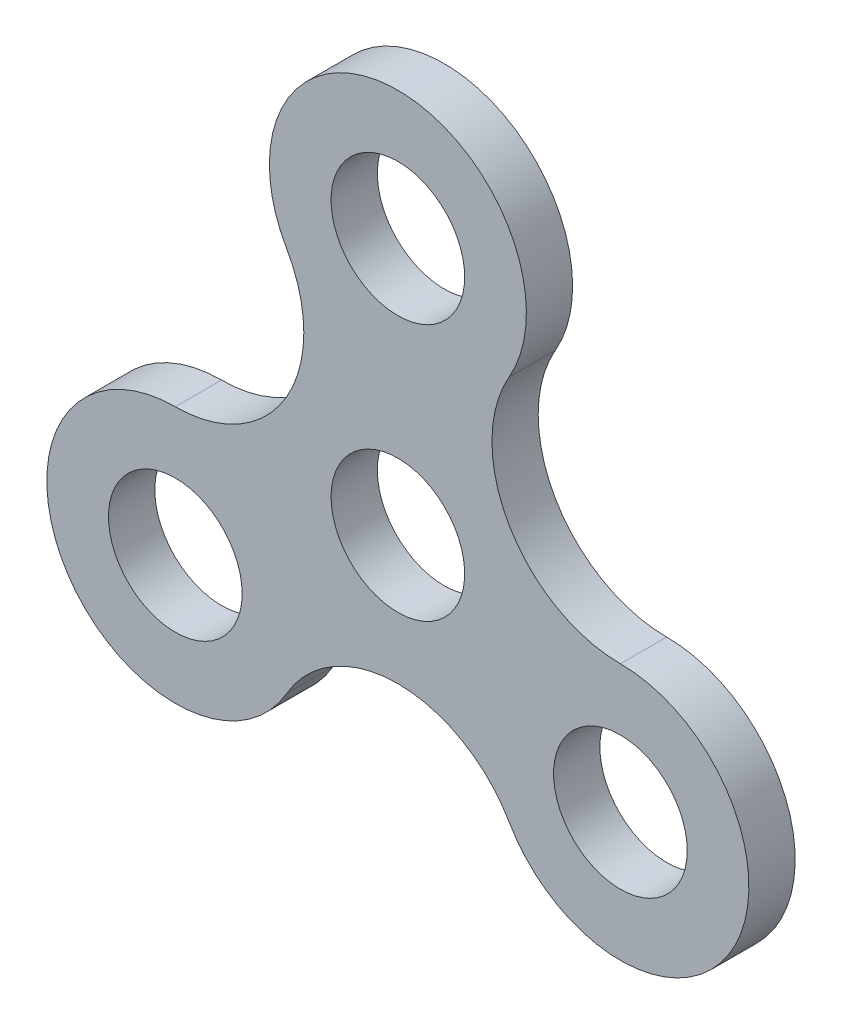
ISO-10303-21;
HEADER;
FILE_DESCRIPTION(('STEP AP214'),'2;1');
FILE_NAME('part.step','',(''),(''),'','','');
FILE_SCHEMA(('AUTOMOTIVE_DESIGN { 1 0 10303 214 1 1 1 1 }'));
ENDSEC;
DATA;
#1=APPLICATION_CONTEXT('core data for automotive mechanical design processes');
#2=APPLICATION_PROTOCOL_DEFINITION('international standard','automotive_design',2000,#1);
#3=PRODUCT_CONTEXT('',#1,'mechanical');
#4=PRODUCT('Part','Part','',(#3));
#5=PRODUCT_RELATED_PRODUCT_CATEGORY('part','',(#4));
#6=PRODUCT_DEFINITION_FORMATION('','',#4);
#7=PRODUCT_DEFINITION_CONTEXT('part definition',#1,'design');
#8=PRODUCT_DEFINITION('design','',#6,#7);
#9=PRODUCT_DEFINITION_SHAPE('','',#8);
#10=(LENGTH_UNIT() NAMED_UNIT(*) SI_UNIT(.MILLI.,.METRE.));
#11=(NAMED_UNIT(*) PLANE_ANGLE_UNIT() SI_UNIT($,.RADIAN.));
#12=(NAMED_UNIT(*) SI_UNIT($,.STERADIAN.) SOLID_ANGLE_UNIT());
#13=UNCERTAINTY_MEASURE_WITH_UNIT(LENGTH_MEASURE(1.E-05),#10,'distance_accuracy_value','');
#14=(GEOMETRIC_REPRESENTATION_CONTEXT(3) GLOBAL_UNCERTAINTY_ASSIGNED_CONTEXT((#13)) GLOBAL_UNIT_ASSIGNED_CONTEXT((#10,
#11,#12)) REPRESENTATION_CONTEXT('',''));
#15=CARTESIAN_POINT('',(0.,0.,0.));
#16=DIRECTION('',(0.,0.,1.));
#17=DIRECTION('',(1.,0.,0.));
#18=AXIS2_PLACEMENT_3D('',#15,#16,#17);
#19=CARTESIAN_POINT('',(433.012701892219,249.999999999998,45.));
#20=DIRECTION('',(0.,0.,-1.));
#21=DIRECTION('',(-1.,0.,0.));
#22=AXIS2_PLACEMENT_3D('',#19,#20,#21);
#23=CYLINDRICAL_SURFACE('',#22,250.);
#24=CARTESIAN_POINT('',(433.012701892219,249.999999999998,-45.));
#25=DIRECTION('',(0.,0.,-1.));
#26=DIRECTION('',(1.,0.,0.));
#27=AXIS2_PLACEMENT_3D('',#24,#25,#26);
#28=CIRCLE('',#27,250.);
#29=CARTESIAN_POINT('',(433.012701892219,-1.88737914186277E-12,-45.));
#30=VERTEX_POINT('',#29);
#31=CARTESIAN_POINT('',(216.506350946109,374.999999999999,-45.));
#32=VERTEX_POINT('',#31);
#33=EDGE_CURVE('E118',#30,#32,#28,.T.);
#34=ORIENTED_EDGE('',*,*,#33,.T.);
#35=DIRECTION('',(0.,0.,-1.));
#36=VECTOR('',#35,1.);
#37=CARTESIAN_POINT('',(216.506350946109,374.999999999999,45.));
#38=LINE('',#37,#36);
#39=CARTESIAN_POINT('',(216.506350946109,374.999999999999,45.));
#40=VERTEX_POINT('',#39);
#41=EDGE_CURVE('E11',#40,#32,#38,.T.);
#42=ORIENTED_EDGE('',*,*,#41,.F.);
#43=CARTESIAN_POINT('',(433.012701892219,249.999999999998,45.));
#44=DIRECTION('',(0.,0.,-1.));
#45=DIRECTION('',(1.,0.,0.));
#46=AXIS2_PLACEMENT_3D('',#43,#44,#45);
#47=CIRCLE('',#46,250.);
#48=CARTESIAN_POINT('',(433.012701892219,-1.88737914186277E-12,45.));
#49=VERTEX_POINT('',#48);
#50=EDGE_CURVE('E129',#49,#40,#47,.T.);
#51=ORIENTED_EDGE('',*,*,#50,.F.);
#52=DIRECTION('',(0.,0.,-1.));
#53=VECTOR('',#52,1.);
#54=CARTESIAN_POINT('',(433.012701892219,-1.88737914186277E-12,45.));
#55=LINE('',#54,#53);
#56=EDGE_CURVE('E114',#49,#30,#55,.T.);
#57=ORIENTED_EDGE('',*,*,#56,.T.);
#58=EDGE_LOOP('',(#34,#42,#51,#57));
#59=FACE_BOUND('',#58,.T.);
#60=ADVANCED_FACE('F34',(#59),#23,.F.);
#61=CARTESIAN_POINT('',(0.,500.,45.));
#62=DIRECTION('',(0.,0.,-1.));
#63=DIRECTION('',(-1.,0.,0.));
#64=AXIS2_PLACEMENT_3D('',#61,#62,#63);
#65=CYLINDRICAL_SURFACE('',#64,250.);
#66=CARTESIAN_POINT('',(0.,500.,-45.));
#67=DIRECTION('',(0.,0.,1.));
#68=DIRECTION('',(1.,0.,0.));
#69=AXIS2_PLACEMENT_3D('',#66,#67,#68);
#70=CIRCLE('',#69,250.);
#71=CARTESIAN_POINT('',(-216.50635094611,374.999999999999,-45.));
#72=VERTEX_POINT('',#71);
#73=EDGE_CURVE('E121',#32,#72,#70,.T.);
#74=ORIENTED_EDGE('',*,*,#73,.T.);
#75=DIRECTION('',(0.,0.,-1.));
#76=VECTOR('',#75,1.);
#77=CARTESIAN_POINT('',(-216.50635094611,374.999999999999,45.));
#78=LINE('',#77,#76);
#79=CARTESIAN_POINT('',(-216.50635094611,374.999999999999,45.));
#80=VERTEX_POINT('',#79);
#81=EDGE_CURVE('E42',#80,#72,#78,.T.);
#82=ORIENTED_EDGE('',*,*,#81,.F.);
#83=CARTESIAN_POINT('',(0.,500.,45.));
#84=DIRECTION('',(0.,0.,1.));
#85=DIRECTION('',(1.,0.,0.));
#86=AXIS2_PLACEMENT_3D('',#83,#84,#85);
#87=CIRCLE('',#86,250.);
#88=EDGE_CURVE('E87',#40,#80,#87,.T.);
#89=ORIENTED_EDGE('',*,*,#88,.F.);
#90=ORIENTED_EDGE('',*,*,#41,.T.);
#91=EDGE_LOOP('',(#74,#82,#89,#90));
#92=FACE_BOUND('',#91,.T.);
#93=ADVANCED_FACE('F154',(#92),#65,.T.);
#94=CARTESIAN_POINT('',(-433.01270189222,249.999999999999,45.));
#95=DIRECTION('',(0.,0.,-1.));
#96=DIRECTION('',(-1.,0.,0.));
#97=AXIS2_PLACEMENT_3D('',#94,#95,#96);
#98=CYLINDRICAL_SURFACE('',#97,250.000000000001);
#99=CARTESIAN_POINT('',(-433.01270189222,249.999999999999,-45.));
#100=DIRECTION('',(0.,0.,-1.));
#101=DIRECTION('',(1.,0.,0.));
#102=AXIS2_PLACEMENT_3D('',#99,#100,#101);
#103=CIRCLE('',#102,250.000000000001);
#104=CARTESIAN_POINT('',(-433.012701892219,-1.88737914186277E-12,-45.));
#105=VERTEX_POINT('',#104);
#106=EDGE_CURVE('E124',#72,#105,#103,.T.);
#107=ORIENTED_EDGE('',*,*,#106,.T.);
#108=DIRECTION('',(0.,0.,-1.));
#109=VECTOR('',#108,1.);
#110=CARTESIAN_POINT('',(-433.012701892219,-1.88737914186277E-12,45.));
#111=LINE('',#110,#109);
#112=CARTESIAN_POINT('',(-433.012701892219,-1.88737914186277E-12,45.));
#113=VERTEX_POINT('',#112);
#114=EDGE_CURVE('E109',#113,#105,#111,.T.);
#115=ORIENTED_EDGE('',*,*,#114,.F.);
#116=CARTESIAN_POINT('',(-433.01270189222,249.999999999999,45.));
#117=DIRECTION('',(0.,0.,-1.));
#118=DIRECTION('',(1.,0.,0.));
#119=AXIS2_PLACEMENT_3D('',#116,#117,#118);
#120=CIRCLE('',#119,250.000000000001);
#121=EDGE_CURVE('E100',#80,#113,#120,.T.);
#122=ORIENTED_EDGE('',*,*,#121,.F.);
#123=ORIENTED_EDGE('',*,*,#81,.T.);
#124=EDGE_LOOP('',(#107,#115,#122,#123));
#125=FACE_BOUND('',#124,.T.);
#126=ADVANCED_FACE('F135',(#125),#98,.F.);
#127=CARTESIAN_POINT('',(-433.012701892218,-250.000000000002,45.));
#128=DIRECTION('',(0.,0.,-1.));
#129=DIRECTION('',(-1.,0.,0.));
#130=AXIS2_PLACEMENT_3D('',#127,#128,#129);
#131=CYLINDRICAL_SURFACE('',#130,250.);
#132=CARTESIAN_POINT('',(-433.012701892218,-250.000000000002,-45.));
#133=DIRECTION('',(0.,0.,1.));
#134=DIRECTION('',(1.,0.,0.));
#135=AXIS2_PLACEMENT_3D('',#132,#133,#134);
#136=CIRCLE('',#135,250.);
#137=CARTESIAN_POINT('',(-216.506350946107,-375.,-45.));
#138=VERTEX_POINT('',#137);
#139=EDGE_CURVE('E108',#105,#138,#136,.T.);
#140=ORIENTED_EDGE('',*,*,#139,.T.);
#141=DIRECTION('',(0.,0.,-1.));
#142=VECTOR('',#141,1.);
#143=CARTESIAN_POINT('',(-216.506350946107,-375.,45.));
#144=LINE('',#143,#142);
#145=CARTESIAN_POINT('',(-216.506350946107,-375.,45.));
#146=VERTEX_POINT('',#145);
#147=EDGE_CURVE('E105',#146,#138,#144,.T.);
#148=ORIENTED_EDGE('',*,*,#147,.F.);
#149=CARTESIAN_POINT('',(-433.012701892218,-250.000000000002,45.));
#150=DIRECTION('',(0.,0.,1.));
#151=DIRECTION('',(1.,0.,0.));
#152=AXIS2_PLACEMENT_3D('',#149,#150,#151);
#153=CIRCLE('',#152,250.);
#154=EDGE_CURVE('E94',#113,#146,#153,.T.);
#155=ORIENTED_EDGE('',*,*,#154,.F.);
#156=ORIENTED_EDGE('',*,*,#114,.T.);
#157=EDGE_LOOP('',(#140,#148,#155,#156));
#158=FACE_BOUND('',#157,.T.);
#159=ADVANCED_FACE('F106',(#158),#131,.T.);
#160=CARTESIAN_POINT('',(1.67617655866259E-13,-499.999999999996,45.));
#161=DIRECTION('',(0.,0.,-1.));
#162=DIRECTION('',(-1.,0.,0.));
#163=AXIS2_PLACEMENT_3D('',#160,#161,#162);
#164=CYLINDRICAL_SURFACE('',#163,249.999999999996);
#165=CARTESIAN_POINT('',(1.67617655866259E-13,-499.999999999996,-45.));
#166=DIRECTION('',(0.,0.,-1.));
#167=DIRECTION('',(1.,0.,0.));
#168=AXIS2_PLACEMENT_3D('',#165,#166,#167);
#169=CIRCLE('',#168,249.999999999996);
#170=CARTESIAN_POINT('',(216.506350946107,-375.,-45.));
#171=VERTEX_POINT('',#170);
#172=EDGE_CURVE('E73',#138,#171,#169,.T.);
#173=ORIENTED_EDGE('',*,*,#172,.T.);
#174=DIRECTION('',(0.,0.,-1.));
#175=VECTOR('',#174,1.);
#176=CARTESIAN_POINT('',(216.506350946107,-375.,45.));
#177=LINE('',#176,#175);
#178=CARTESIAN_POINT('',(216.506350946107,-375.,45.));
#179=VERTEX_POINT('',#178);
#180=EDGE_CURVE('E110',#179,#171,#177,.T.);
#181=ORIENTED_EDGE('',*,*,#180,.F.);
#182=CARTESIAN_POINT('',(1.67617655866259E-13,-499.999999999996,45.));
#183=DIRECTION('',(0.,0.,-1.));
#184=DIRECTION('',(1.,0.,0.));
#185=AXIS2_PLACEMENT_3D('',#182,#183,#184);
#186=CIRCLE('',#185,249.999999999996);
#187=EDGE_CURVE('E98',#146,#179,#186,.T.);
#188=ORIENTED_EDGE('',*,*,#187,.F.);
#189=ORIENTED_EDGE('',*,*,#147,.T.);
#190=EDGE_LOOP('',(#173,#181,#188,#189));
#191=FACE_BOUND('',#190,.T.);
#192=ADVANCED_FACE('F112',(#191),#164,.F.);
#193=CARTESIAN_POINT('',(433.012701892218,-250.000000000002,45.));
#194=DIRECTION('',(0.,0.,-1.));
#195=DIRECTION('',(-1.,0.,0.));
#196=AXIS2_PLACEMENT_3D('',#193,#194,#195);
#197=CYLINDRICAL_SURFACE('',#196,250.);
#198=CARTESIAN_POINT('',(433.012701892218,-250.000000000002,-45.));
#199=DIRECTION('',(0.,0.,1.));
#200=DIRECTION('',(1.,0.,0.));
#201=AXIS2_PLACEMENT_3D('',#198,#199,#200);
#202=CIRCLE('',#201,250.);
#203=EDGE_CURVE('E79',#171,#30,#202,.T.);
#204=ORIENTED_EDGE('',*,*,#203,.T.);
#205=ORIENTED_EDGE('',*,*,#56,.F.);
#206=CARTESIAN_POINT('',(433.012701892218,-250.000000000002,45.));
#207=DIRECTION('',(0.,0.,1.));
#208=DIRECTION('',(1.,0.,0.));
#209=AXIS2_PLACEMENT_3D('',#206,#207,#208);
#210=CIRCLE('',#209,250.);
#211=EDGE_CURVE('E50',#179,#49,#210,.T.);
#212=ORIENTED_EDGE('',*,*,#211,.F.);
#213=ORIENTED_EDGE('',*,*,#180,.T.);
#214=EDGE_LOOP('',(#204,#205,#212,#213));
#215=FACE_BOUND('',#214,.T.);
#216=ADVANCED_FACE('F142',(#215),#197,.T.);
#217=CARTESIAN_POINT('',(433.012701892219,-1.80411241501588E-12,45.));
#218=DIRECTION('',(0.,0.,1.));
#219=DIRECTION('',(1.,0.,0.));
#220=AXIS2_PLACEMENT_3D('',#217,#218,#219);
#221=PLANE('',#220);
#222=CARTESIAN_POINT('',(-433.012701892218,-250.000000000002,45.));
#223=DIRECTION('',(0.,0.,1.));
#224=DIRECTION('',(1.,0.,0.));
#225=AXIS2_PLACEMENT_3D('',#222,#223,#224);
#226=CIRCLE('',#225,130.);
#227=CARTESIAN_POINT('',(-303.012701892218,-250.000000000002,45.));
#228=VERTEX_POINT('',#227);
#229=EDGE_CURVE('E240',#228,#228,#226,.T.);
#230=ORIENTED_EDGE('',*,*,#229,.F.);
#231=EDGE_LOOP('',(#230));
#232=FACE_BOUND('',#231,.T.);
#233=CARTESIAN_POINT('',(433.012701892218,-250.000000000002,45.));
#234=DIRECTION('',(0.,0.,1.));
#235=DIRECTION('',(1.,0.,0.));
#236=AXIS2_PLACEMENT_3D('',#233,#234,#235);
#237=CIRCLE('',#236,130.);
#238=CARTESIAN_POINT('',(563.012701892218,-250.000000000002,45.));
#239=VERTEX_POINT('',#238);
#240=EDGE_CURVE('E246',#239,#239,#237,.T.);
#241=ORIENTED_EDGE('',*,*,#240,.F.);
#242=EDGE_LOOP('',(#241));
#243=FACE_BOUND('',#242,.T.);
#244=CARTESIAN_POINT('',(0.,500.,45.));
#245=DIRECTION('',(0.,0.,1.));
#246=DIRECTION('',(1.,0.,0.));
#247=AXIS2_PLACEMENT_3D('',#244,#245,#246);
#248=CIRCLE('',#247,130.);
#249=CARTESIAN_POINT('',(130.,500.,45.));
#250=VERTEX_POINT('',#249);
#251=EDGE_CURVE('E254',#250,#250,#248,.T.);
#252=ORIENTED_EDGE('',*,*,#251,.F.);
#253=EDGE_LOOP('',(#252));
#254=FACE_BOUND('',#253,.T.);
#255=CARTESIAN_POINT('',(0.,0.,45.));
#256=DIRECTION('',(0.,0.,-1.));
#257=DIRECTION('',(-1.,0.,0.));
#258=AXIS2_PLACEMENT_3D('',#255,#256,#257);
#259=CIRCLE('',#258,130.);
#260=CARTESIAN_POINT('',(-130.,0.,45.));
#261=VERTEX_POINT('',#260);
#262=EDGE_CURVE('E122',#261,#261,#259,.T.);
#263=ORIENTED_EDGE('',*,*,#262,.T.);
#264=EDGE_LOOP('',(#263));
#265=FACE_BOUND('',#264,.T.);
#266=ORIENTED_EDGE('',*,*,#50,.T.);
#267=ORIENTED_EDGE('',*,*,#88,.T.);
#268=ORIENTED_EDGE('',*,*,#121,.T.);
#269=ORIENTED_EDGE('',*,*,#154,.T.);
#270=ORIENTED_EDGE('',*,*,#187,.T.);
#271=ORIENTED_EDGE('',*,*,#211,.T.);
#272=EDGE_LOOP('',(#266,#267,#268,#269,#270,#271));
#273=FACE_BOUND('',#272,.T.);
#274=ADVANCED_FACE('F96',(#232,#243,#254,#265,#273),#221,.T.);
#275=CARTESIAN_POINT('',(433.012701892219,-1.80411241501588E-12,-45.));
#276=DIRECTION('',(0.,0.,1.));
#277=DIRECTION('',(1.,0.,0.));
#278=AXIS2_PLACEMENT_3D('',#275,#276,#277);
#279=PLANE('',#278);
#280=CARTESIAN_POINT('',(-433.012701892218,-250.000000000002,-45.));
#281=DIRECTION('',(0.,0.,1.));
#282=DIRECTION('',(1.,0.,0.));
#283=AXIS2_PLACEMENT_3D('',#280,#281,#282);
#284=CIRCLE('',#283,130.);
#285=CARTESIAN_POINT('',(-303.012701892218,-250.000000000002,-45.));
#286=VERTEX_POINT('',#285);
#287=EDGE_CURVE('E237',#286,#286,#284,.T.);
#288=ORIENTED_EDGE('',*,*,#287,.T.);
#289=EDGE_LOOP('',(#288));
#290=FACE_BOUND('',#289,.T.);
#291=CARTESIAN_POINT('',(433.012701892218,-250.000000000002,-45.));
#292=DIRECTION('',(0.,0.,1.));
#293=DIRECTION('',(1.,0.,0.));
#294=AXIS2_PLACEMENT_3D('',#291,#292,#293);
#295=CIRCLE('',#294,130.);
#296=CARTESIAN_POINT('',(563.012701892218,-250.000000000002,-45.));
#297=VERTEX_POINT('',#296);
#298=EDGE_CURVE('E241',#297,#297,#295,.T.);
#299=ORIENTED_EDGE('',*,*,#298,.T.);
#300=EDGE_LOOP('',(#299));
#301=FACE_BOUND('',#300,.T.);
#302=CARTESIAN_POINT('',(0.,500.,-45.));
#303=DIRECTION('',(0.,0.,1.));
#304=DIRECTION('',(1.,0.,0.));
#305=AXIS2_PLACEMENT_3D('',#302,#303,#304);
#306=CIRCLE('',#305,130.);
#307=CARTESIAN_POINT('',(130.,500.,-45.));
#308=VERTEX_POINT('',#307);
#309=EDGE_CURVE('E251',#308,#308,#306,.T.);
#310=ORIENTED_EDGE('',*,*,#309,.T.);
#311=EDGE_LOOP('',(#310));
#312=FACE_BOUND('',#311,.T.);
#313=CARTESIAN_POINT('',(0.,0.,-45.));
#314=DIRECTION('',(0.,0.,-1.));
#315=DIRECTION('',(-1.,0.,0.));
#316=AXIS2_PLACEMENT_3D('',#313,#314,#315);
#317=CIRCLE('',#316,130.);
#318=CARTESIAN_POINT('',(-130.,0.,-45.));
#319=VERTEX_POINT('',#318);
#320=EDGE_CURVE('E243',#319,#319,#317,.T.);
#321=ORIENTED_EDGE('',*,*,#320,.F.);
#322=EDGE_LOOP('',(#321));
#323=FACE_BOUND('',#322,.T.);
#324=ORIENTED_EDGE('',*,*,#33,.F.);
#325=ORIENTED_EDGE('',*,*,#203,.F.);
#326=ORIENTED_EDGE('',*,*,#172,.F.);
#327=ORIENTED_EDGE('',*,*,#139,.F.);
#328=ORIENTED_EDGE('',*,*,#106,.F.);
#329=ORIENTED_EDGE('',*,*,#73,.F.);
#330=EDGE_LOOP('',(#324,#325,#326,#327,#328,#329));
#331=FACE_BOUND('',#330,.T.);
#332=ADVANCED_FACE('F138',(#290,#301,#312,#323,#331),#279,.F.);
#333=CARTESIAN_POINT('',(0.,0.,45.));
#334=DIRECTION('',(0.,0.,-1.));
#335=DIRECTION('',(-1.,0.,0.));
#336=AXIS2_PLACEMENT_3D('',#333,#334,#335);
#337=CYLINDRICAL_SURFACE('',#336,130.);
#338=CARTESIAN_POINT('',(-130.,0.,45.));
#339=CARTESIAN_POINT('',(-130.,0.,44.0625));
#340=CARTESIAN_POINT('',(-130.,0.,43.125));
#341=CARTESIAN_POINT('',(-130.,0.,41.25));
#342=CARTESIAN_POINT('',(-130.,0.,40.3125));
#343=CARTESIAN_POINT('',(-130.,0.,38.4375));
#344=CARTESIAN_POINT('',(-130.,0.,37.5));
#345=CARTESIAN_POINT('',(-130.,0.,35.625));
#346=CARTESIAN_POINT('',(-130.,0.,34.6875));
#347=CARTESIAN_POINT('',(-130.,0.,32.8125));
#348=CARTESIAN_POINT('',(-130.,0.,31.875));
#349=CARTESIAN_POINT('',(-130.,0.,30.));
#350=CARTESIAN_POINT('',(-130.,0.,29.0625));
#351=CARTESIAN_POINT('',(-130.,0.,27.1875));
#352=CARTESIAN_POINT('',(-130.,0.,26.25));
#353=CARTESIAN_POINT('',(-130.,0.,24.375));
#354=CARTESIAN_POINT('',(-130.,0.,23.4375));
#355=CARTESIAN_POINT('',(-130.,0.,21.5625));
#356=CARTESIAN_POINT('',(-130.,0.,20.625));
#357=CARTESIAN_POINT('',(-130.,0.,18.75));
#358=CARTESIAN_POINT('',(-130.,0.,17.8125));
#359=CARTESIAN_POINT('',(-130.,0.,15.9375));
#360=CARTESIAN_POINT('',(-130.,0.,15.));
#361=CARTESIAN_POINT('',(-130.,0.,13.125));
#362=CARTESIAN_POINT('',(-130.,0.,12.1875));
#363=CARTESIAN_POINT('',(-130.,0.,10.3125));
#364=CARTESIAN_POINT('',(-130.,0.,9.37500000000001));
#365=CARTESIAN_POINT('',(-130.,0.,7.50000000000001));
#366=CARTESIAN_POINT('',(-130.,0.,6.56250000000001));
#367=CARTESIAN_POINT('',(-130.,0.,4.68750000000001));
#368=CARTESIAN_POINT('',(-130.,0.,3.75000000000002));
#369=CARTESIAN_POINT('',(-130.,0.,1.87500000000002));
#370=CARTESIAN_POINT('',(-130.,0.,0.937500000000015));
#371=CARTESIAN_POINT('',(-130.,0.,-0.937499999999987));
#372=CARTESIAN_POINT('',(-130.,0.,-1.87499999999999));
#373=CARTESIAN_POINT('',(-130.,0.,-3.74999999999999));
#374=CARTESIAN_POINT('',(-130.,0.,-4.68749999999999));
#375=CARTESIAN_POINT('',(-130.,0.,-6.56249999999998));
#376=CARTESIAN_POINT('',(-130.,0.,-7.49999999999999));
#377=CARTESIAN_POINT('',(-130.,0.,-9.37499999999999));
#378=CARTESIAN_POINT('',(-130.,0.,-10.3125));
#379=CARTESIAN_POINT('',(-130.,0.,-12.1875));
#380=CARTESIAN_POINT('',(-130.,0.,-13.125));
#381=CARTESIAN_POINT('',(-130.,0.,-15.));
#382=CARTESIAN_POINT('',(-130.,0.,-15.9375));
#383=CARTESIAN_POINT('',(-130.,0.,-17.8125));
#384=CARTESIAN_POINT('',(-130.,0.,-18.75));
#385=CARTESIAN_POINT('',(-130.,0.,-20.625));
#386=CARTESIAN_POINT('',(-130.,0.,-21.5625));
#387=CARTESIAN_POINT('',(-130.,0.,-23.4375));
#388=CARTESIAN_POINT('',(-130.,0.,-24.375));
#389=CARTESIAN_POINT('',(-130.,0.,-26.25));
#390=CARTESIAN_POINT('',(-130.,0.,-27.1875));
#391=CARTESIAN_POINT('',(-130.,0.,-29.0625));
#392=CARTESIAN_POINT('',(-130.,0.,-30.));
#393=CARTESIAN_POINT('',(-130.,0.,-31.875));
#394=CARTESIAN_POINT('',(-130.,0.,-32.8125));
#395=CARTESIAN_POINT('',(-130.,0.,-34.6875));
#396=CARTESIAN_POINT('',(-130.,0.,-35.625));
#397=CARTESIAN_POINT('',(-130.,0.,-37.5));
#398=CARTESIAN_POINT('',(-130.,0.,-38.4375));
#399=CARTESIAN_POINT('',(-130.,0.,-40.3125));
#400=CARTESIAN_POINT('',(-130.,0.,-41.25));
#401=CARTESIAN_POINT('',(-130.,0.,-43.125));
#402=CARTESIAN_POINT('',(-130.,0.,-44.0625));
#403=CARTESIAN_POINT('',(-130.,0.,-45.));
#404=B_SPLINE_CURVE_WITH_KNOTS('',3,(#338,#339,#340,#341,#342,#343,#344,#345,#346,#347,#348,
#349,#350,#351,#352,#353,#354,#355,#356,#357,#358,#359,#360,#361,#362,#363,#364,#365,#366,#367,
#368,#369,#370,#371,#372,#373,#374,#375,#376,#377,#378,#379,#380,#381,#382,#383,#384,#385,#386,
#387,#388,#389,#390,#391,#392,#393,#394,#395,#396,#397,#398,#399,#400,#401,#402,#403),
.UNSPECIFIED.,.F.,.F.,(4,2,2,2,2,2,2,2,2,2,2,2,2,2,2,2,2,2,2,2,2,2,2,2,2,2,2,2,2,2,2,2,4),(0.,
2.8125,5.62500000000001,8.4375,11.25,14.0625,16.875,19.6875,22.5,25.3125,28.125,30.9375,33.75,
36.5625,39.375,42.1875,45.,47.8125,50.625,53.4375,56.25,59.0625,61.875,64.6875,67.5,70.3125,
73.125,75.9375,78.75,81.5625,84.375,87.1875,90.),.UNSPECIFIED.);
#405=EDGE_CURVE('BSEAM182',#261,#319,#404,.T.);
#406=ORIENTED_EDGE('',*,*,#262,.F.);
#407=ORIENTED_EDGE('',*,*,#320,.T.);
#408=ORIENTED_EDGE('',*,*,#405,.T.);
#409=ORIENTED_EDGE('',*,*,#405,.F.);
#410=EDGE_LOOP('',(#406,#408,#407,#409));
#411=FACE_BOUND('',#410,.T.);
#412=ADVANCED_FACE('F182',(#411),#337,.F.);
#413=CARTESIAN_POINT('',(0.,500.,-45.));
#414=DIRECTION('',(0.,0.,1.));
#415=DIRECTION('',(1.,0.,0.));
#416=AXIS2_PLACEMENT_3D('',#413,#414,#415);
#417=CYLINDRICAL_SURFACE('',#416,130.);
#418=CARTESIAN_POINT('',(130.,500.,-45.));
#419=CARTESIAN_POINT('',(130.,500.,-44.0625));
#420=CARTESIAN_POINT('',(130.,500.,-43.125));
#421=CARTESIAN_POINT('',(130.,500.,-41.25));
#422=CARTESIAN_POINT('',(130.,500.,-40.3125));
#423=CARTESIAN_POINT('',(130.,500.,-38.4375));
#424=CARTESIAN_POINT('',(130.,500.,-37.5));
#425=CARTESIAN_POINT('',(130.,500.,-35.625));
#426=CARTESIAN_POINT('',(130.,500.,-34.6875));
#427=CARTESIAN_POINT('',(130.,500.,-32.8125));
#428=CARTESIAN_POINT('',(130.,500.,-31.875));
#429=CARTESIAN_POINT('',(130.,500.,-30.));
#430=CARTESIAN_POINT('',(130.,500.,-29.0625));
#431=CARTESIAN_POINT('',(130.,500.,-27.1875));
#432=CARTESIAN_POINT('',(130.,500.,-26.25));
#433=CARTESIAN_POINT('',(130.,500.,-24.375));
#434=CARTESIAN_POINT('',(130.,500.,-23.4375));
#435=CARTESIAN_POINT('',(130.,500.,-21.5625));
#436=CARTESIAN_POINT('',(130.,500.,-20.625));
#437=CARTESIAN_POINT('',(130.,500.,-18.75));
#438=CARTESIAN_POINT('',(130.,500.,-17.8125));
#439=CARTESIAN_POINT('',(130.,500.,-15.9375));
#440=CARTESIAN_POINT('',(130.,500.,-15.));
#441=CARTESIAN_POINT('',(130.,500.,-13.125));
#442=CARTESIAN_POINT('',(130.,500.,-12.1875));
#443=CARTESIAN_POINT('',(130.,500.,-10.3125));
#444=CARTESIAN_POINT('',(130.,500.,-9.37500000000001));
#445=CARTESIAN_POINT('',(130.,500.,-7.50000000000001));
#446=CARTESIAN_POINT('',(130.,500.,-6.56250000000001));
#447=CARTESIAN_POINT('',(130.,500.,-4.68750000000001));
#448=CARTESIAN_POINT('',(130.,500.,-3.75000000000002));
#449=CARTESIAN_POINT('',(130.,500.,-1.87500000000002));
#450=CARTESIAN_POINT('',(130.,500.,-0.937500000000015));
#451=CARTESIAN_POINT('',(130.,500.,0.937499999999987));
#452=CARTESIAN_POINT('',(130.,500.,1.87499999999999));
#453=CARTESIAN_POINT('',(130.,500.,3.74999999999999));
#454=CARTESIAN_POINT('',(130.,500.,4.68749999999999));
#455=CARTESIAN_POINT('',(130.,500.,6.56249999999998));
#456=CARTESIAN_POINT('',(130.,500.,7.49999999999999));
#457=CARTESIAN_POINT('',(130.,500.,9.37499999999999));
#458=CARTESIAN_POINT('',(130.,500.,10.3125));
#459=CARTESIAN_POINT('',(130.,500.,12.1875));
#460=CARTESIAN_POINT('',(130.,500.,13.125));
#461=CARTESIAN_POINT('',(130.,500.,15.));
#462=CARTESIAN_POINT('',(130.,500.,15.9375));
#463=CARTESIAN_POINT('',(130.,500.,17.8125));
#464=CARTESIAN_POINT('',(130.,500.,18.75));
#465=CARTESIAN_POINT('',(130.,500.,20.625));
#466=CARTESIAN_POINT('',(130.,500.,21.5625));
#467=CARTESIAN_POINT('',(130.,500.,23.4375));
#468=CARTESIAN_POINT('',(130.,500.,24.375));
#469=CARTESIAN_POINT('',(130.,500.,26.25));
#470=CARTESIAN_POINT('',(130.,500.,27.1875));
#471=CARTESIAN_POINT('',(130.,500.,29.0625));
#472=CARTESIAN_POINT('',(130.,500.,30.));
#473=CARTESIAN_POINT('',(130.,500.,31.875));
#474=CARTESIAN_POINT('',(130.,500.,32.8125));
#475=CARTESIAN_POINT('',(130.,500.,34.6875));
#476=CARTESIAN_POINT('',(130.,500.,35.625));
#477=CARTESIAN_POINT('',(130.,500.,37.5));
#478=CARTESIAN_POINT('',(130.,500.,38.4375));
#479=CARTESIAN_POINT('',(130.,500.,40.3125));
#480=CARTESIAN_POINT('',(130.,500.,41.25));
#481=CARTESIAN_POINT('',(130.,500.,43.125));
#482=CARTESIAN_POINT('',(130.,500.,44.0625));
#483=CARTESIAN_POINT('',(130.,500.,45.));
#484=B_SPLINE_CURVE_WITH_KNOTS('',3,(#418,#419,#420,#421,#422,#423,#424,#425,#426,#427,#428,
#429,#430,#431,#432,#433,#434,#435,#436,#437,#438,#439,#440,#441,#442,#443,#444,#445,#446,#447,
#448,#449,#450,#451,#452,#453,#454,#455,#456,#457,#458,#459,#460,#461,#462,#463,#464,#465,#466,
#467,#468,#469,#470,#471,#472,#473,#474,#475,#476,#477,#478,#479,#480,#481,#482,#483),
.UNSPECIFIED.,.F.,.F.,(4,2,2,2,2,2,2,2,2,2,2,2,2,2,2,2,2,2,2,2,2,2,2,2,2,2,2,2,2,2,2,2,4),(0.,
2.8125,5.62500000000001,8.4375,11.25,14.0625,16.875,19.6875,22.5,25.3125,28.125,30.9375,33.75,
36.5625,39.375,42.1875,45.,47.8125,50.625,53.4375,56.25,59.0625,61.875,64.6875,67.5,70.3125,
73.125,75.9375,78.75,81.5625,84.375,87.1875,90.),.UNSPECIFIED.);
#485=EDGE_CURVE('BSEAM187',#308,#250,#484,.T.);
#486=ORIENTED_EDGE('',*,*,#309,.F.);
#487=ORIENTED_EDGE('',*,*,#251,.T.);
#488=ORIENTED_EDGE('',*,*,#485,.T.);
#489=ORIENTED_EDGE('',*,*,#485,.F.);
#490=EDGE_LOOP('',(#486,#488,#487,#489));
#491=FACE_BOUND('',#490,.T.);
#492=ADVANCED_FACE('F187',(#491),#417,.F.);
#493=CARTESIAN_POINT('',(433.012701892218,-250.000000000002,-45.));
#494=DIRECTION('',(0.,0.,1.));
#495=DIRECTION('',(1.,0.,0.));
#496=AXIS2_PLACEMENT_3D('',#493,#494,#495);
#497=CYLINDRICAL_SURFACE('',#496,130.);
#498=CARTESIAN_POINT('',(563.012701892218,-250.000000000002,-45.));
#499=CARTESIAN_POINT('',(563.012701892218,-250.000000000002,-44.0625));
#500=CARTESIAN_POINT('',(563.012701892218,-250.000000000002,-43.125));
#501=CARTESIAN_POINT('',(563.012701892218,-250.000000000002,-41.25));
#502=CARTESIAN_POINT('',(563.012701892218,-250.000000000002,-40.3125));
#503=CARTESIAN_POINT('',(563.012701892218,-250.000000000002,-38.4375));
#504=CARTESIAN_POINT('',(563.012701892218,-250.000000000002,-37.5));
#505=CARTESIAN_POINT('',(563.012701892218,-250.000000000002,-35.625));
#506=CARTESIAN_POINT('',(563.012701892218,-250.000000000002,-34.6875));
#507=CARTESIAN_POINT('',(563.012701892218,-250.000000000002,-32.8125));
#508=CARTESIAN_POINT('',(563.012701892218,-250.000000000002,-31.875));
#509=CARTESIAN_POINT('',(563.012701892218,-250.000000000002,-30.));
#510=CARTESIAN_POINT('',(563.012701892218,-250.000000000002,-29.0625));
#511=CARTESIAN_POINT('',(563.012701892218,-250.000000000002,-27.1875));
#512=CARTESIAN_POINT('',(563.012701892218,-250.000000000002,-26.25));
#513=CARTESIAN_POINT('',(563.012701892218,-250.000000000002,-24.375));
#514=CARTESIAN_POINT('',(563.012701892218,-250.000000000002,-23.4375));
#515=CARTESIAN_POINT('',(563.012701892218,-250.000000000002,-21.5625));
#516=CARTESIAN_POINT('',(563.012701892218,-250.000000000002,-20.625));
#517=CARTESIAN_POINT('',(563.012701892218,-250.000000000002,-18.75));
#518=CARTESIAN_POINT('',(563.012701892218,-250.000000000002,-17.8125));
#519=CARTESIAN_POINT('',(563.012701892218,-250.000000000002,-15.9375));
#520=CARTESIAN_POINT('',(563.012701892218,-250.000000000002,-15.));
#521=CARTESIAN_POINT('',(563.012701892218,-250.000000000002,-13.125));
#522=CARTESIAN_POINT('',(563.012701892218,-250.000000000002,-12.1875));
#523=CARTESIAN_POINT('',(563.012701892218,-250.000000000002,-10.3125));
#524=CARTESIAN_POINT('',(563.012701892218,-250.000000000002,-9.37500000000001));
#525=CARTESIAN_POINT('',(563.012701892218,-250.000000000002,-7.50000000000001));
#526=CARTESIAN_POINT('',(563.012701892218,-250.000000000002,-6.56250000000001));
#527=CARTESIAN_POINT('',(563.012701892218,-250.000000000002,-4.68750000000001));
#528=CARTESIAN_POINT('',(563.012701892218,-250.000000000002,-3.75000000000002));
#529=CARTESIAN_POINT('',(563.012701892218,-250.000000000002,-1.87500000000002));
#530=CARTESIAN_POINT('',(563.012701892218,-250.000000000002,-0.937500000000015));
#531=CARTESIAN_POINT('',(563.012701892218,-250.000000000002,0.937499999999987));
#532=CARTESIAN_POINT('',(563.012701892218,-250.000000000002,1.87499999999999));
#533=CARTESIAN_POINT('',(563.012701892218,-250.000000000002,3.74999999999999));
#534=CARTESIAN_POINT('',(563.012701892218,-250.000000000002,4.68749999999999));
#535=CARTESIAN_POINT('',(563.012701892218,-250.000000000002,6.56249999999998));
#536=CARTESIAN_POINT('',(563.012701892218,-250.000000000002,7.49999999999999));
#537=CARTESIAN_POINT('',(563.012701892218,-250.000000000002,9.37499999999999));
#538=CARTESIAN_POINT('',(563.012701892218,-250.000000000002,10.3125));
#539=CARTESIAN_POINT('',(563.012701892218,-250.000000000002,12.1875));
#540=CARTESIAN_POINT('',(563.012701892218,-250.000000000002,13.125));
#541=CARTESIAN_POINT('',(563.012701892218,-250.000000000002,15.));
#542=CARTESIAN_POINT('',(563.012701892218,-250.000000000002,15.9375));
#543=CARTESIAN_POINT('',(563.012701892218,-250.000000000002,17.8125));
#544=CARTESIAN_POINT('',(563.012701892218,-250.000000000002,18.75));
#545=CARTESIAN_POINT('',(563.012701892218,-250.000000000002,20.625));
#546=CARTESIAN_POINT('',(563.012701892218,-250.000000000002,21.5625));
#547=CARTESIAN_POINT('',(563.012701892218,-250.000000000002,23.4375));
#548=CARTESIAN_POINT('',(563.012701892218,-250.000000000002,24.375));
#549=CARTESIAN_POINT('',(563.012701892218,-250.000000000002,26.25));
#550=CARTESIAN_POINT('',(563.012701892218,-250.000000000002,27.1875));
#551=CARTESIAN_POINT('',(563.012701892218,-250.000000000002,29.0625));
#552=CARTESIAN_POINT('',(563.012701892218,-250.000000000002,30.));
#553=CARTESIAN_POINT('',(563.012701892218,-250.000000000002,31.875));
#554=CARTESIAN_POINT('',(563.012701892218,-250.000000000002,32.8125));
#555=CARTESIAN_POINT('',(563.012701892218,-250.000000000002,34.6875));
#556=CARTESIAN_POINT('',(563.012701892218,-250.000000000002,35.625));
#557=CARTESIAN_POINT('',(563.012701892218,-250.000000000002,37.5));
#558=CARTESIAN_POINT('',(563.012701892218,-250.000000000002,38.4375));
#559=CARTESIAN_POINT('',(563.012701892218,-250.000000000002,40.3125));
#560=CARTESIAN_POINT('',(563.012701892218,-250.000000000002,41.25));
#561=CARTESIAN_POINT('',(563.012701892218,-250.000000000002,43.125));
#562=CARTESIAN_POINT('',(563.012701892218,-250.000000000002,44.0625));
#563=CARTESIAN_POINT('',(563.012701892218,-250.000000000002,45.));
#564=B_SPLINE_CURVE_WITH_KNOTS('',3,(#498,#499,#500,#501,#502,#503,#504,#505,#506,#507,#508,
#509,#510,#511,#512,#513,#514,#515,#516,#517,#518,#519,#520,#521,#522,#523,#524,#525,#526,#527,
#528,#529,#530,#531,#532,#533,#534,#535,#536,#537,#538,#539,#540,#541,#542,#543,#544,#545,#546,
#547,#548,#549,#550,#551,#552,#553,#554,#555,#556,#557,#558,#559,#560,#561,#562,#563),
.UNSPECIFIED.,.F.,.F.,(4,2,2,2,2,2,2,2,2,2,2,2,2,2,2,2,2,2,2,2,2,2,2,2,2,2,2,2,2,2,2,2,4),(0.,
2.8125,5.62500000000001,8.4375,11.25,14.0625,16.875,19.6875,22.5,25.3125,28.125,30.9375,33.75,
36.5625,39.375,42.1875,45.,47.8125,50.625,53.4375,56.25,59.0625,61.875,64.6875,67.5,70.3125,
73.125,75.9375,78.75,81.5625,84.375,87.1875,90.),.UNSPECIFIED.);
#565=EDGE_CURVE('BSEAM210',#297,#239,#564,.T.);
#566=ORIENTED_EDGE('',*,*,#298,.F.);
#567=ORIENTED_EDGE('',*,*,#240,.T.);
#568=ORIENTED_EDGE('',*,*,#565,.T.);
#569=ORIENTED_EDGE('',*,*,#565,.F.);
#570=EDGE_LOOP('',(#566,#568,#567,#569));
#571=FACE_BOUND('',#570,.T.);
#572=ADVANCED_FACE('F210',(#571),#497,.F.);
#573=CARTESIAN_POINT('',(-433.012701892218,-250.000000000002,-45.));
#574=DIRECTION('',(0.,0.,1.));
#575=DIRECTION('',(1.,0.,0.));
#576=AXIS2_PLACEMENT_3D('',#573,#574,#575);
#577=CYLINDRICAL_SURFACE('',#576,130.);
#578=CARTESIAN_POINT('',(-303.012701892218,-250.000000000002,-45.));
#579=CARTESIAN_POINT('',(-303.012701892218,-250.000000000002,-44.0625));
#580=CARTESIAN_POINT('',(-303.012701892218,-250.000000000002,-43.125));
#581=CARTESIAN_POINT('',(-303.012701892218,-250.000000000002,-41.25));
#582=CARTESIAN_POINT('',(-303.012701892218,-250.000000000002,-40.3125));
#583=CARTESIAN_POINT('',(-303.012701892218,-250.000000000002,-38.4375));
#584=CARTESIAN_POINT('',(-303.012701892218,-250.000000000002,-37.5));
#585=CARTESIAN_POINT('',(-303.012701892218,-250.000000000002,-35.625));
#586=CARTESIAN_POINT('',(-303.012701892218,-250.000000000002,-34.6875));
#587=CARTESIAN_POINT('',(-303.012701892218,-250.000000000002,-32.8125));
#588=CARTESIAN_POINT('',(-303.012701892218,-250.000000000002,-31.875));
#589=CARTESIAN_POINT('',(-303.012701892218,-250.000000000002,-30.));
#590=CARTESIAN_POINT('',(-303.012701892218,-250.000000000002,-29.0625));
#591=CARTESIAN_POINT('',(-303.012701892218,-250.000000000002,-27.1875));
#592=CARTESIAN_POINT('',(-303.012701892218,-250.000000000002,-26.25));
#593=CARTESIAN_POINT('',(-303.012701892218,-250.000000000002,-24.375));
#594=CARTESIAN_POINT('',(-303.012701892218,-250.000000000002,-23.4375));
#595=CARTESIAN_POINT('',(-303.012701892218,-250.000000000002,-21.5625));
#596=CARTESIAN_POINT('',(-303.012701892218,-250.000000000002,-20.625));
#597=CARTESIAN_POINT('',(-303.012701892218,-250.000000000002,-18.75));
#598=CARTESIAN_POINT('',(-303.012701892218,-250.000000000002,-17.8125));
#599=CARTESIAN_POINT('',(-303.012701892218,-250.000000000002,-15.9375));
#600=CARTESIAN_POINT('',(-303.012701892218,-250.000000000002,-15.));
#601=CARTESIAN_POINT('',(-303.012701892218,-250.000000000002,-13.125));
#602=CARTESIAN_POINT('',(-303.012701892218,-250.000000000002,-12.1875));
#603=CARTESIAN_POINT('',(-303.012701892218,-250.000000000002,-10.3125));
#604=CARTESIAN_POINT('',(-303.012701892218,-250.000000000002,-9.37500000000001));
#605=CARTESIAN_POINT('',(-303.012701892218,-250.000000000002,-7.50000000000001));
#606=CARTESIAN_POINT('',(-303.012701892218,-250.000000000002,-6.56250000000001));
#607=CARTESIAN_POINT('',(-303.012701892218,-250.000000000002,-4.68750000000001));
#608=CARTESIAN_POINT('',(-303.012701892218,-250.000000000002,-3.75000000000002));
#609=CARTESIAN_POINT('',(-303.012701892218,-250.000000000002,-1.87500000000002));
#610=CARTESIAN_POINT('',(-303.012701892218,-250.000000000002,-0.937500000000015));
#611=CARTESIAN_POINT('',(-303.012701892218,-250.000000000002,0.937499999999987));
#612=CARTESIAN_POINT('',(-303.012701892218,-250.000000000002,1.87499999999999));
#613=CARTESIAN_POINT('',(-303.012701892218,-250.000000000002,3.74999999999999));
#614=CARTESIAN_POINT('',(-303.012701892218,-250.000000000002,4.68749999999999));
#615=CARTESIAN_POINT('',(-303.012701892218,-250.000000000002,6.56249999999998));
#616=CARTESIAN_POINT('',(-303.012701892218,-250.000000000002,7.49999999999999));
#617=CARTESIAN_POINT('',(-303.012701892218,-250.000000000002,9.37499999999999));
#618=CARTESIAN_POINT('',(-303.012701892218,-250.000000000002,10.3125));
#619=CARTESIAN_POINT('',(-303.012701892218,-250.000000000002,12.1875));
#620=CARTESIAN_POINT('',(-303.012701892218,-250.000000000002,13.125));
#621=CARTESIAN_POINT('',(-303.012701892218,-250.000000000002,15.));
#622=CARTESIAN_POINT('',(-303.012701892218,-250.000000000002,15.9375));
#623=CARTESIAN_POINT('',(-303.012701892218,-250.000000000002,17.8125));
#624=CARTESIAN_POINT('',(-303.012701892218,-250.000000000002,18.75));
#625=CARTESIAN_POINT('',(-303.012701892218,-250.000000000002,20.625));
#626=CARTESIAN_POINT('',(-303.012701892218,-250.000000000002,21.5625));
#627=CARTESIAN_POINT('',(-303.012701892218,-250.000000000002,23.4375));
#628=CARTESIAN_POINT('',(-303.012701892218,-250.000000000002,24.375));
#629=CARTESIAN_POINT('',(-303.012701892218,-250.000000000002,26.25));
#630=CARTESIAN_POINT('',(-303.012701892218,-250.000000000002,27.1875));
#631=CARTESIAN_POINT('',(-303.012701892218,-250.000000000002,29.0625));
#632=CARTESIAN_POINT('',(-303.012701892218,-250.000000000002,30.));
#633=CARTESIAN_POINT('',(-303.012701892218,-250.000000000002,31.875));
#634=CARTESIAN_POINT('',(-303.012701892218,-250.000000000002,32.8125));
#635=CARTESIAN_POINT('',(-303.012701892218,-250.000000000002,34.6875));
#636=CARTESIAN_POINT('',(-303.012701892218,-250.000000000002,35.625));
#637=CARTESIAN_POINT('',(-303.012701892218,-250.000000000002,37.5));
#638=CARTESIAN_POINT('',(-303.012701892218,-250.000000000002,38.4375));
#639=CARTESIAN_POINT('',(-303.012701892218,-250.000000000002,40.3125));
#640=CARTESIAN_POINT('',(-303.012701892218,-250.000000000002,41.25));
#641=CARTESIAN_POINT('',(-303.012701892218,-250.000000000002,43.125));
#642=CARTESIAN_POINT('',(-303.012701892218,-250.000000000002,44.0625));
#643=CARTESIAN_POINT('',(-303.012701892218,-250.000000000002,45.));
#644=B_SPLINE_CURVE_WITH_KNOTS('',3,(#578,#579,#580,#581,#582,#583,#584,#585,#586,#587,#588,
#589,#590,#591,#592,#593,#594,#595,#596,#597,#598,#599,#600,#601,#602,#603,#604,#605,#606,#607,
#608,#609,#610,#611,#612,#613,#614,#615,#616,#617,#618,#619,#620,#621,#622,#623,#624,#625,#626,
#627,#628,#629,#630,#631,#632,#633,#634,#635,#636,#637,#638,#639,#640,#641,#642,#643),
.UNSPECIFIED.,.F.,.F.,(4,2,2,2,2,2,2,2,2,2,2,2,2,2,2,2,2,2,2,2,2,2,2,2,2,2,2,2,2,2,2,2,4),(0.,
2.8125,5.62500000000001,8.4375,11.25,14.0625,16.875,19.6875,22.5,25.3125,28.125,30.9375,33.75,
36.5625,39.375,42.1875,45.,47.8125,50.625,53.4375,56.25,59.0625,61.875,64.6875,67.5,70.3125,
73.125,75.9375,78.75,81.5625,84.375,87.1875,90.),.UNSPECIFIED.);
#645=EDGE_CURVE('BSEAM220',#286,#228,#644,.T.);
#646=ORIENTED_EDGE('',*,*,#287,.F.);
#647=ORIENTED_EDGE('',*,*,#229,.T.);
#648=ORIENTED_EDGE('',*,*,#645,.T.);
#649=ORIENTED_EDGE('',*,*,#645,.F.);
#650=EDGE_LOOP('',(#646,#648,#647,#649));
#651=FACE_BOUND('',#650,.T.);
#652=ADVANCED_FACE('F220',(#651),#577,.F.);
#653=CLOSED_SHELL('',(#60,#93,#126,#159,#192,#216,#274,#332,#412,#492,#572,#652));
#654=MANIFOLD_SOLID_BREP('B2',#653);
#655=ADVANCED_BREP_SHAPE_REPRESENTATION('',(#18,#654),#14);
#656=SHAPE_DEFINITION_REPRESENTATION(#9,#655);
ENDSEC;
END-ISO-10303-21;
